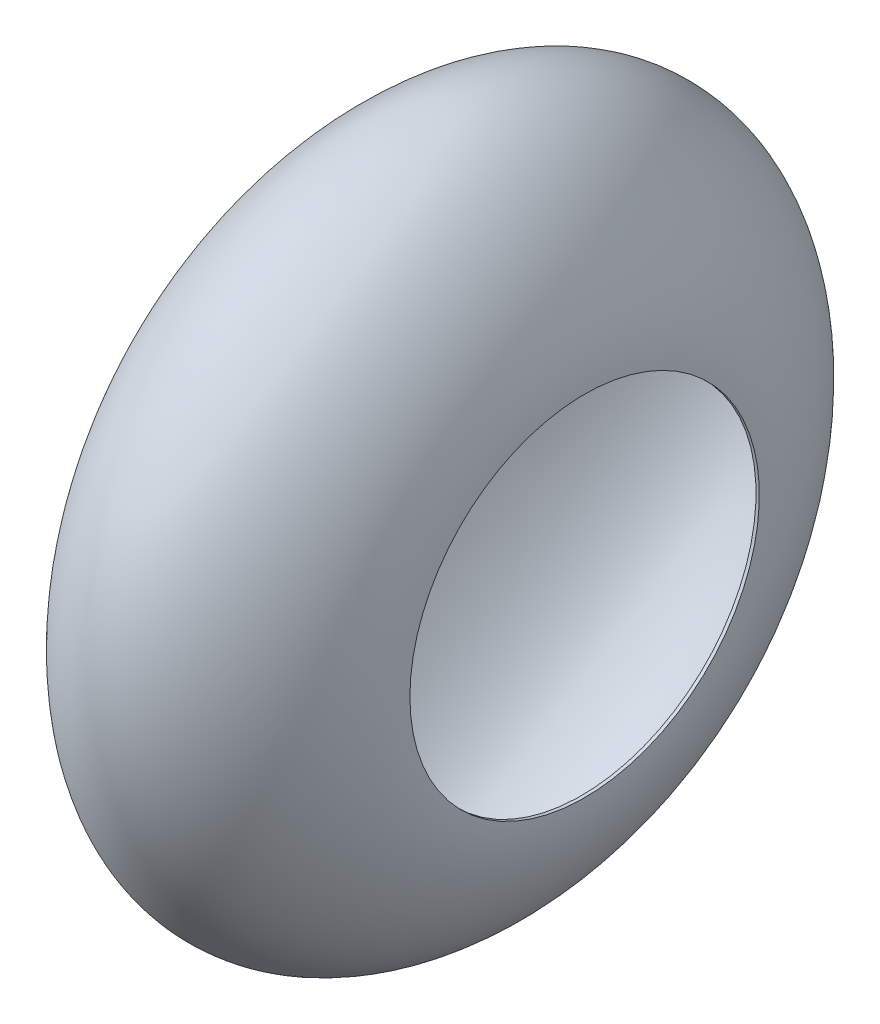
ISO-10303-21;
HEADER;
FILE_DESCRIPTION(('STEP AP214'),'2;1');
FILE_NAME('part.step','',(''),(''),'','','');
FILE_SCHEMA(('AUTOMOTIVE_DESIGN { 1 0 10303 214 1 1 1 1 }'));
ENDSEC;
DATA;
#1=APPLICATION_CONTEXT('core data for automotive mechanical design processes');
#2=APPLICATION_PROTOCOL_DEFINITION('international standard','automotive_design',2000,#1);
#3=PRODUCT_CONTEXT('',#1,'mechanical');
#4=PRODUCT('Part','Part','',(#3));
#5=PRODUCT_RELATED_PRODUCT_CATEGORY('part','',(#4));
#6=PRODUCT_DEFINITION_FORMATION('','',#4);
#7=PRODUCT_DEFINITION_CONTEXT('part definition',#1,'design');
#8=PRODUCT_DEFINITION('design','',#6,#7);
#9=PRODUCT_DEFINITION_SHAPE('','',#8);
#10=(LENGTH_UNIT() NAMED_UNIT(*) SI_UNIT(.MILLI.,.METRE.));
#11=(NAMED_UNIT(*) PLANE_ANGLE_UNIT() SI_UNIT($,.RADIAN.));
#12=(NAMED_UNIT(*) SI_UNIT($,.STERADIAN.) SOLID_ANGLE_UNIT());
#13=UNCERTAINTY_MEASURE_WITH_UNIT(LENGTH_MEASURE(1.E-05),#10,'distance_accuracy_value','');
#14=(GEOMETRIC_REPRESENTATION_CONTEXT(3) GLOBAL_UNCERTAINTY_ASSIGNED_CONTEXT((#13)) GLOBAL_UNIT_ASSIGNED_CONTEXT((#10,
#11,#12)) REPRESENTATION_CONTEXT('',''));
#15=CARTESIAN_POINT('',(0.,0.,0.));
#16=DIRECTION('',(0.,0.,1.));
#17=DIRECTION('',(1.,0.,0.));
#18=AXIS2_PLACEMENT_3D('',#15,#16,#17);
#19=CARTESIAN_POINT('',(-57.8851006945941,102.625586580429,0.));
#20=CARTESIAN_POINT('',(-52.9922210825531,115.538990883007,0.));
#21=CARTESIAN_POINT('',(-47.8930254586103,125.668530211407,0.));
#22=CARTESIAN_POINT('',(-37.5796360274463,141.216295787523,0.));
#23=CARTESIAN_POINT('',(-32.3673777717486,146.630951613332,0.));
#24=CARTESIAN_POINT('',(-24.7035185847379,151.901289004184,0.));
#25=CARTESIAN_POINT('',(-22.1747319030148,153.184045862233,0.));
#26=CARTESIAN_POINT('',(-17.1945093866427,154.925839289186,0.));
#27=CARTESIAN_POINT('',(-14.7426985561969,155.385515352762,0.));
#28=CARTESIAN_POINT('',(-9.92668636814895,155.59675680558,0.));
#29=CARTESIAN_POINT('',(-7.56173049340768,155.34805072337,0.));
#30=CARTESIAN_POINT('',(-2.93462904257333,154.239354518087,0.));
#31=CARTESIAN_POINT('',(-0.672614434269485,153.378836047953,0.));
#32=CARTESIAN_POINT('',(5.91092299776879,150.0217694724,0.));
#33=CARTESIAN_POINT('',(10.0287262045855,146.747044513768,0.));
#34=CARTESIAN_POINT('',(17.4124069831606,138.957815210794,0.));
#35=CARTESIAN_POINT('',(20.6776665216954,134.445263147854,0.));
#36=CARTESIAN_POINT('',(26.0657360316494,125.058515871251,0.));
#37=CARTESIAN_POINT('',(28.1886489131892,120.183905927035,0.));
#38=CARTESIAN_POINT('',(30.3137039108369,113.27087684576,0.));
#39=CARTESIAN_POINT('',(30.8455637219446,111.033175253518,0.));
#40=CARTESIAN_POINT('',(31.3559765979543,107.864102955375,0.));
#41=CARTESIAN_POINT('',(31.478245455083,106.839032174794,0.));
#42=CARTESIAN_POINT('',(31.587558199267,105.359743823075,0.));
#43=CARTESIAN_POINT('',(31.6116527417987,104.876371035614,0.));
#44=CARTESIAN_POINT('',(31.629061111127,104.167351236304,0.));
#45=CARTESIAN_POINT('',(31.6316178578268,103.936153403469,0.));
#46=CARTESIAN_POINT('',(31.6309995383628,103.468140709436,0.));
#47=CARTESIAN_POINT('',(31.6283945155968,103.22529044189,0.));
#48=CARTESIAN_POINT('',(31.6313532566825,102.968388503275,0.));
#49=B_SPLINE_CURVE_WITH_KNOTS('',3,(#19,#20,#21,#22,#23,#24,#25,#26,#27,#28,#29,#30,#31,#32,#33,
#34,#35,#36,#37,#38,#39,#40,#41,#42,#43,#44,#45,#46,#47,#48),.UNSPECIFIED.,.F.,.F.,(4,2,2,2,2,2,
2,2,2,2,2,2,2,2,4),(0.,0.125,0.25,0.3125,0.375,0.4375,0.5,0.625,0.75,0.875,0.9375,0.96875,
0.984375,0.9921875,1.),.UNSPECIFIED.);
#50=CARTESIAN_POINT('',(-58.8202256264104,50.3614247799327,0.));
#51=DIRECTION('',(-1.,0.,0.));
#52=AXIS1_PLACEMENT('',#50,#51);
#53=SURFACE_OF_REVOLUTION('',#49,#52);
#54=CARTESIAN_POINT('',(31.6313532566825,50.3614247799327,0.));
#55=DIRECTION('',(-1.,0.,0.));
#56=DIRECTION('',(0.,0.,1.));
#57=AXIS2_PLACEMENT_3D('',#54,#55,#56);
#58=CIRCLE('',#57,52.6069637233419);
#59=CARTESIAN_POINT('',(31.6313532566825,50.3614247799327,52.6069637233419));
#60=VERTEX_POINT('',#59);
#61=EDGE_CURVE('E10',#60,#60,#58,.T.);
#62=ORIENTED_EDGE('',*,*,#61,.F.);
#63=EDGE_LOOP('',(#62));
#64=FACE_BOUND('',#63,.T.);
#65=CARTESIAN_POINT('',(-57.8851006945941,50.3614247799327,0.));
#66=DIRECTION('',(-1.,0.,0.));
#67=DIRECTION('',(0.,0.,1.));
#68=AXIS2_PLACEMENT_3D('',#65,#66,#67);
#69=CIRCLE('',#68,52.2641618004966);
#70=CARTESIAN_POINT('',(-57.8851006945941,50.3614247799327,52.2641618004966));
#71=VERTEX_POINT('',#70);
#72=EDGE_CURVE('E44',#71,#71,#69,.T.);
#73=ORIENTED_EDGE('',*,*,#72,.T.);
#74=EDGE_LOOP('',(#73));
#75=FACE_BOUND('',#74,.T.);
#76=ADVANCED_FACE('F29',(#64,#75),#53,.T.);
#77=CARTESIAN_POINT('',(32.6312869425696,50.3614247799327,0.));
#78=DIRECTION('',(1.,0.,0.));
#79=DIRECTION('',(0.,0.,-1.));
#80=AXIS2_PLACEMENT_3D('',#77,#78,#79);
#81=CONICAL_SURFACE('',#80,52.61847996528,0.0115164965079595);
#82=ORIENTED_EDGE('',*,*,#61,.T.);
#83=EDGE_LOOP('',(#82));
#84=FACE_BOUND('',#83,.T.);
#85=CARTESIAN_POINT('',(32.6312869425696,50.3614247799327,0.));
#86=DIRECTION('',(-1.,0.,0.));
#87=DIRECTION('',(0.,0.,1.));
#88=AXIS2_PLACEMENT_3D('',#85,#86,#87);
#89=CIRCLE('',#88,52.61847996528);
#90=CARTESIAN_POINT('',(32.6312869425696,50.3614247799327,52.61847996528));
#91=VERTEX_POINT('',#90);
#92=EDGE_CURVE('E36',#91,#91,#89,.T.);
#93=ORIENTED_EDGE('',*,*,#92,.F.);
#94=EDGE_LOOP('',(#93));
#95=FACE_BOUND('',#94,.T.);
#96=ADVANCED_FACE('F63',(#84,#95),#81,.F.);
#97=CARTESIAN_POINT('',(-58.8202256264104,102.979904745213,0.));
#98=CARTESIAN_POINT('',(-19.8672789677196,205.78544848729,0.));
#99=CARTESIAN_POINT('',(33.0451510527151,133.6915238843,0.));
#100=CARTESIAN_POINT('',(32.6280919269108,103.257321961814,0.));
#101=CARTESIAN_POINT('',(32.6312869425696,102.979904745213,0.));
#102=B_SPLINE_CURVE_WITH_KNOTS('',3,(#97,#98,#99,#100,#101),.UNSPECIFIED.,.F.,.F.,(4,1,4),(0.,
0.991062374522091,1.),.UNSPECIFIED.);
#103=CARTESIAN_POINT('',(-58.8202256264104,50.3614247799327,0.));
#104=DIRECTION('',(-1.,0.,0.));
#105=AXIS1_PLACEMENT('',#103,#104);
#106=SURFACE_OF_REVOLUTION('',#102,#105);
#107=ORIENTED_EDGE('',*,*,#92,.T.);
#108=EDGE_LOOP('',(#107));
#109=FACE_BOUND('',#108,.T.);
#110=CARTESIAN_POINT('',(-58.8202256264104,50.3614247799327,0.));
#111=DIRECTION('',(-1.,0.,0.));
#112=DIRECTION('',(0.,0.,1.));
#113=AXIS2_PLACEMENT_3D('',#110,#111,#112);
#114=CIRCLE('',#113,52.61847996528);
#115=CARTESIAN_POINT('',(-58.8202256264104,50.3614247799327,52.61847996528));
#116=VERTEX_POINT('',#115);
#117=EDGE_CURVE('E40',#116,#116,#114,.T.);
#118=ORIENTED_EDGE('',*,*,#117,.F.);
#119=EDGE_LOOP('',(#118));
#120=FACE_BOUND('',#119,.T.);
#121=ADVANCED_FACE('F59',(#109,#120),#106,.F.);
#122=CARTESIAN_POINT('',(-57.8851006945941,50.3614247799327,0.));
#123=DIRECTION('',(-1.,0.,0.));
#124=DIRECTION('',(0.,0.,1.));
#125=AXIS2_PLACEMENT_3D('',#122,#123,#124);
#126=CONICAL_SURFACE('',#125,52.2641618004966,0.362184828358374);
#127=ORIENTED_EDGE('',*,*,#117,.T.);
#128=EDGE_LOOP('',(#127));
#129=FACE_BOUND('',#128,.T.);
#130=ORIENTED_EDGE('',*,*,#72,.F.);
#131=EDGE_LOOP('',(#130));
#132=FACE_BOUND('',#131,.T.);
#133=ADVANCED_FACE('F62',(#129,#132),#126,.F.);
#134=CLOSED_SHELL('',(#76,#96,#121,#133));
#135=MANIFOLD_SOLID_BREP('B2',#134);
#136=ADVANCED_BREP_SHAPE_REPRESENTATION('',(#18,#135),#14);
#137=SHAPE_DEFINITION_REPRESENTATION(#9,#136);
ENDSEC;
END-ISO-10303-21;
